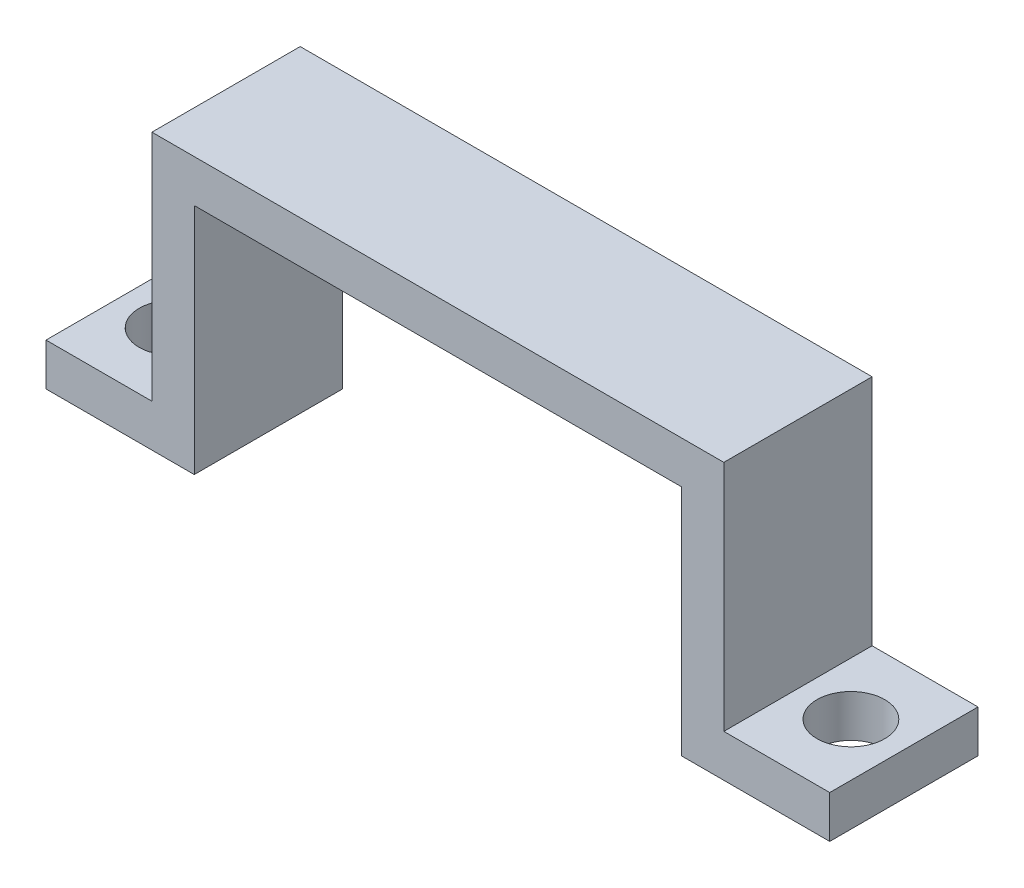
ISO-10303-21;
HEADER;
FILE_DESCRIPTION(('STEP AP214'),'2;1');
FILE_NAME('part.step','',(''),(''),'','','');
FILE_SCHEMA(('AUTOMOTIVE_DESIGN { 1 0 10303 214 1 1 1 1 }'));
ENDSEC;
DATA;
#1=APPLICATION_CONTEXT('core data for automotive mechanical design processes');
#2=APPLICATION_PROTOCOL_DEFINITION('international standard','automotive_design',2000,#1);
#3=PRODUCT_CONTEXT('',#1,'mechanical');
#4=PRODUCT('Part','Part','',(#3));
#5=PRODUCT_RELATED_PRODUCT_CATEGORY('part','',(#4));
#6=PRODUCT_DEFINITION_FORMATION('','',#4);
#7=PRODUCT_DEFINITION_CONTEXT('part definition',#1,'design');
#8=PRODUCT_DEFINITION('design','',#6,#7);
#9=PRODUCT_DEFINITION_SHAPE('','',#8);
#10=(LENGTH_UNIT() NAMED_UNIT(*) SI_UNIT(.MILLI.,.METRE.));
#11=(NAMED_UNIT(*) PLANE_ANGLE_UNIT() SI_UNIT($,.RADIAN.));
#12=(NAMED_UNIT(*) SI_UNIT($,.STERADIAN.) SOLID_ANGLE_UNIT());
#13=UNCERTAINTY_MEASURE_WITH_UNIT(LENGTH_MEASURE(1.E-05),#10,'distance_accuracy_value','');
#14=(GEOMETRIC_REPRESENTATION_CONTEXT(3) GLOBAL_UNCERTAINTY_ASSIGNED_CONTEXT((#13)) GLOBAL_UNIT_ASSIGNED_CONTEXT((#10,
#11,#12)) REPRESENTATION_CONTEXT('',''));
#15=CARTESIAN_POINT('',(0.,0.,0.));
#16=DIRECTION('',(0.,0.,1.));
#17=DIRECTION('',(1.,0.,0.));
#18=AXIS2_PLACEMENT_3D('',#15,#16,#17);
#19=CARTESIAN_POINT('',(13.5,-11.,7.));
#20=DIRECTION('',(0.,-1.,0.));
#21=DIRECTION('',(0.,0.,-1.));
#22=AXIS2_PLACEMENT_3D('',#19,#20,#21);
#23=PLANE('',#22);
#24=CARTESIAN_POINT('',(16.,-11.,3.5));
#25=DIRECTION('',(0.,1.,0.));
#26=DIRECTION('',(0.,0.,1.));
#27=AXIS2_PLACEMENT_3D('',#24,#25,#26);
#28=CIRCLE('',#27,1.6);
#29=CARTESIAN_POINT('',(16.,-11.,5.1));
#30=VERTEX_POINT('',#29);
#31=EDGE_CURVE('E262',#30,#30,#28,.T.);
#32=ORIENTED_EDGE('',*,*,#31,.F.);
#33=EDGE_LOOP('',(#32));
#34=FACE_BOUND('',#33,.T.);
#35=DIRECTION('',(-1.,0.,0.));
#36=VECTOR('',#35,1.);
#37=CARTESIAN_POINT('',(13.5,-11.,0.));
#38=LINE('',#37,#36);
#39=CARTESIAN_POINT('',(18.5,-11.,0.));
#40=VERTEX_POINT('',#39);
#41=CARTESIAN_POINT('',(13.5,-11.,0.));
#42=VERTEX_POINT('',#41);
#43=EDGE_CURVE('E153',#40,#42,#38,.T.);
#44=ORIENTED_EDGE('',*,*,#43,.T.);
#45=DIRECTION('',(0.,0.,-1.));
#46=VECTOR('',#45,1.);
#47=CARTESIAN_POINT('',(13.5,-11.,7.));
#48=LINE('',#47,#46);
#49=CARTESIAN_POINT('',(13.5,-11.,7.));
#50=VERTEX_POINT('',#49);
#51=EDGE_CURVE('E11',#50,#42,#48,.T.);
#52=ORIENTED_EDGE('',*,*,#51,.F.);
#53=DIRECTION('',(-1.,0.,0.));
#54=VECTOR('',#53,1.);
#55=CARTESIAN_POINT('',(13.5,-11.,7.));
#56=LINE('',#55,#54);
#57=CARTESIAN_POINT('',(18.5,-11.,7.));
#58=VERTEX_POINT('',#57);
#59=EDGE_CURVE('E176',#58,#50,#56,.T.);
#60=ORIENTED_EDGE('',*,*,#59,.F.);
#61=DIRECTION('',(0.,0.,-1.));
#62=VECTOR('',#61,1.);
#63=CARTESIAN_POINT('',(18.5,-11.,7.));
#64=LINE('',#63,#62);
#65=EDGE_CURVE('E149',#58,#40,#64,.T.);
#66=ORIENTED_EDGE('',*,*,#65,.T.);
#67=EDGE_LOOP('',(#44,#52,#60,#66));
#68=FACE_BOUND('',#67,.T.);
#69=ADVANCED_FACE('F33',(#34,#68),#23,.F.);
#70=CARTESIAN_POINT('',(13.5,0.,7.));
#71=DIRECTION('',(-1.,0.,0.));
#72=DIRECTION('',(0.,-1.,0.));
#73=AXIS2_PLACEMENT_3D('',#70,#71,#72);
#74=PLANE('',#73);
#75=DIRECTION('',(0.,1.,0.));
#76=VECTOR('',#75,1.);
#77=CARTESIAN_POINT('',(13.5,0.,0.));
#78=LINE('',#77,#76);
#79=CARTESIAN_POINT('',(13.5,0.,0.));
#80=VERTEX_POINT('',#79);
#81=EDGE_CURVE('E156',#42,#80,#78,.T.);
#82=ORIENTED_EDGE('',*,*,#81,.T.);
#83=DIRECTION('',(0.,0.,-1.));
#84=VECTOR('',#83,1.);
#85=CARTESIAN_POINT('',(13.5,0.,7.));
#86=LINE('',#85,#84);
#87=CARTESIAN_POINT('',(13.5,0.,7.));
#88=VERTEX_POINT('',#87);
#89=EDGE_CURVE('E41',#88,#80,#86,.T.);
#90=ORIENTED_EDGE('',*,*,#89,.F.);
#91=DIRECTION('',(0.,1.,0.));
#92=VECTOR('',#91,1.);
#93=CARTESIAN_POINT('',(13.5,0.,7.));
#94=LINE('',#93,#92);
#95=EDGE_CURVE('E104',#50,#88,#94,.T.);
#96=ORIENTED_EDGE('',*,*,#95,.F.);
#97=ORIENTED_EDGE('',*,*,#51,.T.);
#98=EDGE_LOOP('',(#82,#90,#96,#97));
#99=FACE_BOUND('',#98,.T.);
#100=ADVANCED_FACE('F255',(#99),#74,.F.);
#101=CARTESIAN_POINT('',(-13.5,0.,7.));
#102=DIRECTION('',(0.,-1.,0.));
#103=DIRECTION('',(1.,0.,0.));
#104=AXIS2_PLACEMENT_3D('',#101,#102,#103);
#105=PLANE('',#104);
#106=DIRECTION('',(-1.,0.,0.));
#107=VECTOR('',#106,1.);
#108=CARTESIAN_POINT('',(-13.5,0.,0.));
#109=LINE('',#108,#107);
#110=CARTESIAN_POINT('',(-13.5,0.,0.));
#111=VERTEX_POINT('',#110);
#112=EDGE_CURVE('E159',#80,#111,#109,.T.);
#113=ORIENTED_EDGE('',*,*,#112,.T.);
#114=DIRECTION('',(0.,0.,-1.));
#115=VECTOR('',#114,1.);
#116=CARTESIAN_POINT('',(-13.5,0.,7.));
#117=LINE('',#116,#115);
#118=CARTESIAN_POINT('',(-13.5,0.,7.));
#119=VERTEX_POINT('',#118);
#120=EDGE_CURVE('E195',#119,#111,#117,.T.);
#121=ORIENTED_EDGE('',*,*,#120,.F.);
#122=DIRECTION('',(-1.,0.,0.));
#123=VECTOR('',#122,1.);
#124=CARTESIAN_POINT('',(-13.5,0.,7.));
#125=LINE('',#124,#123);
#126=EDGE_CURVE('E203',#88,#119,#125,.T.);
#127=ORIENTED_EDGE('',*,*,#126,.F.);
#128=ORIENTED_EDGE('',*,*,#89,.T.);
#129=EDGE_LOOP('',(#113,#121,#127,#128));
#130=FACE_BOUND('',#129,.T.);
#131=ADVANCED_FACE('F201',(#130),#105,.F.);
#132=CARTESIAN_POINT('',(-13.5,0.,7.));
#133=DIRECTION('',(1.,0.,0.));
#134=DIRECTION('',(0.,0.,-1.));
#135=AXIS2_PLACEMENT_3D('',#132,#133,#134);
#136=PLANE('',#135);
#137=DIRECTION('',(0.,-1.,0.));
#138=VECTOR('',#137,1.);
#139=CARTESIAN_POINT('',(-13.5,0.,0.));
#140=LINE('',#139,#138);
#141=CARTESIAN_POINT('',(-13.5,-11.,0.));
#142=VERTEX_POINT('',#141);
#143=EDGE_CURVE('E161',#111,#142,#140,.T.);
#144=ORIENTED_EDGE('',*,*,#143,.T.);
#145=DIRECTION('',(0.,0.,-1.));
#146=VECTOR('',#145,1.);
#147=CARTESIAN_POINT('',(-13.5,-11.,7.));
#148=LINE('',#147,#146);
#149=CARTESIAN_POINT('',(-13.5,-11.,7.));
#150=VERTEX_POINT('',#149);
#151=EDGE_CURVE('E192',#150,#142,#148,.T.);
#152=ORIENTED_EDGE('',*,*,#151,.F.);
#153=DIRECTION('',(0.,-1.,0.));
#154=VECTOR('',#153,1.);
#155=CARTESIAN_POINT('',(-13.5,0.,7.));
#156=LINE('',#155,#154);
#157=EDGE_CURVE('E221',#119,#150,#156,.T.);
#158=ORIENTED_EDGE('',*,*,#157,.F.);
#159=ORIENTED_EDGE('',*,*,#120,.T.);
#160=EDGE_LOOP('',(#144,#152,#158,#159));
#161=FACE_BOUND('',#160,.T.);
#162=ADVANCED_FACE('F212',(#161),#136,.F.);
#163=CARTESIAN_POINT('',(-13.5,-11.,7.));
#164=DIRECTION('',(0.,-1.,0.));
#165=DIRECTION('',(0.,0.,-1.));
#166=AXIS2_PLACEMENT_3D('',#163,#164,#165);
#167=PLANE('',#166);
#168=CARTESIAN_POINT('',(-16.,-11.,3.5));
#169=DIRECTION('',(0.,1.,0.));
#170=DIRECTION('',(0.,0.,1.));
#171=AXIS2_PLACEMENT_3D('',#168,#169,#170);
#172=CIRCLE('',#171,1.6);
#173=CARTESIAN_POINT('',(-16.,-11.,5.10000000000001));
#174=VERTEX_POINT('',#173);
#175=EDGE_CURVE('E269',#174,#174,#172,.T.);
#176=ORIENTED_EDGE('',*,*,#175,.F.);
#177=EDGE_LOOP('',(#176));
#178=FACE_BOUND('',#177,.T.);
#179=DIRECTION('',(-1.,0.,0.));
#180=VECTOR('',#179,1.);
#181=CARTESIAN_POINT('',(-13.5,-11.,0.));
#182=LINE('',#181,#180);
#183=CARTESIAN_POINT('',(-18.5,-11.,0.));
#184=VERTEX_POINT('',#183);
#185=EDGE_CURVE('E163',#142,#184,#182,.T.);
#186=ORIENTED_EDGE('',*,*,#185,.T.);
#187=DIRECTION('',(0.,0.,-1.));
#188=VECTOR('',#187,1.);
#189=CARTESIAN_POINT('',(-18.5,-11.,7.));
#190=LINE('',#189,#188);
#191=CARTESIAN_POINT('',(-18.5,-11.,7.));
#192=VERTEX_POINT('',#191);
#193=EDGE_CURVE('E189',#192,#184,#190,.T.);
#194=ORIENTED_EDGE('',*,*,#193,.F.);
#195=DIRECTION('',(-1.,0.,0.));
#196=VECTOR('',#195,1.);
#197=CARTESIAN_POINT('',(-13.5,-11.,7.));
#198=LINE('',#197,#196);
#199=EDGE_CURVE('E218',#150,#192,#198,.T.);
#200=ORIENTED_EDGE('',*,*,#199,.F.);
#201=ORIENTED_EDGE('',*,*,#151,.T.);
#202=EDGE_LOOP('',(#186,#194,#200,#201));
#203=FACE_BOUND('',#202,.T.);
#204=ADVANCED_FACE('F216',(#178,#203),#167,.F.);
#205=CARTESIAN_POINT('',(-18.5,-11.,7.));
#206=DIRECTION('',(1.,0.,0.));
#207=DIRECTION('',(0.,0.,-1.));
#208=AXIS2_PLACEMENT_3D('',#205,#206,#207);
#209=PLANE('',#208);
#210=DIRECTION('',(0.,-1.,0.));
#211=VECTOR('',#210,1.);
#212=CARTESIAN_POINT('',(-18.5,-11.,0.));
#213=LINE('',#212,#211);
#214=CARTESIAN_POINT('',(-18.5,-13.,0.));
#215=VERTEX_POINT('',#214);
#216=EDGE_CURVE('E165',#184,#215,#213,.T.);
#217=ORIENTED_EDGE('',*,*,#216,.T.);
#218=DIRECTION('',(0.,0.,-1.));
#219=VECTOR('',#218,1.);
#220=CARTESIAN_POINT('',(-18.5,-13.,7.));
#221=LINE('',#220,#219);
#222=CARTESIAN_POINT('',(-18.5,-13.,7.));
#223=VERTEX_POINT('',#222);
#224=EDGE_CURVE('E186',#223,#215,#221,.T.);
#225=ORIENTED_EDGE('',*,*,#224,.F.);
#226=DIRECTION('',(0.,-1.,0.));
#227=VECTOR('',#226,1.);
#228=CARTESIAN_POINT('',(-18.5,-11.,7.));
#229=LINE('',#228,#227);
#230=EDGE_CURVE('E220',#192,#223,#229,.T.);
#231=ORIENTED_EDGE('',*,*,#230,.F.);
#232=ORIENTED_EDGE('',*,*,#193,.T.);
#233=EDGE_LOOP('',(#217,#225,#231,#232));
#234=FACE_BOUND('',#233,.T.);
#235=ADVANCED_FACE('F280',(#234),#209,.F.);
#236=CARTESIAN_POINT('',(-18.5,-13.,7.));
#237=DIRECTION('',(0.,1.,0.));
#238=DIRECTION('',(0.,0.,1.));
#239=AXIS2_PLACEMENT_3D('',#236,#237,#238);
#240=PLANE('',#239);
#241=CARTESIAN_POINT('',(-16.,-13.,3.5));
#242=DIRECTION('',(0.,1.,0.));
#243=DIRECTION('',(0.,0.,1.));
#244=AXIS2_PLACEMENT_3D('',#241,#242,#243);
#245=CIRCLE('',#244,1.6);
#246=CARTESIAN_POINT('',(-16.,-13.,5.10000000000001));
#247=VERTEX_POINT('',#246);
#248=EDGE_CURVE('E264',#247,#247,#245,.T.);
#249=ORIENTED_EDGE('',*,*,#248,.T.);
#250=EDGE_LOOP('',(#249));
#251=FACE_BOUND('',#250,.T.);
#252=DIRECTION('',(1.,0.,0.));
#253=VECTOR('',#252,1.);
#254=CARTESIAN_POINT('',(-18.5,-13.,0.));
#255=LINE('',#254,#253);
#256=CARTESIAN_POINT('',(-11.5,-13.,0.));
#257=VERTEX_POINT('',#256);
#258=EDGE_CURVE('E167',#215,#257,#255,.T.);
#259=ORIENTED_EDGE('',*,*,#258,.T.);
#260=DIRECTION('',(0.,0.,-1.));
#261=VECTOR('',#260,1.);
#262=CARTESIAN_POINT('',(-11.5,-13.,7.));
#263=LINE('',#262,#261);
#264=CARTESIAN_POINT('',(-11.5,-13.,7.));
#265=VERTEX_POINT('',#264);
#266=EDGE_CURVE('E183',#265,#257,#263,.T.);
#267=ORIENTED_EDGE('',*,*,#266,.F.);
#268=DIRECTION('',(1.,0.,0.));
#269=VECTOR('',#268,1.);
#270=CARTESIAN_POINT('',(-18.5,-13.,7.));
#271=LINE('',#270,#269);
#272=EDGE_CURVE('E223',#223,#265,#271,.T.);
#273=ORIENTED_EDGE('',*,*,#272,.F.);
#274=ORIENTED_EDGE('',*,*,#224,.T.);
#275=EDGE_LOOP('',(#259,#267,#273,#274));
#276=FACE_BOUND('',#275,.T.);
#277=ADVANCED_FACE('F286',(#251,#276),#240,.F.);
#278=CARTESIAN_POINT('',(-11.5,-13.,7.));
#279=DIRECTION('',(-1.,0.,0.));
#280=DIRECTION('',(0.,0.,1.));
#281=AXIS2_PLACEMENT_3D('',#278,#279,#280);
#282=PLANE('',#281);
#283=DIRECTION('',(0.,1.,0.));
#284=VECTOR('',#283,1.);
#285=CARTESIAN_POINT('',(-11.5,-13.,0.));
#286=LINE('',#285,#284);
#287=CARTESIAN_POINT('',(-11.5,-2.,0.));
#288=VERTEX_POINT('',#287);
#289=EDGE_CURVE('E169',#257,#288,#286,.T.);
#290=ORIENTED_EDGE('',*,*,#289,.T.);
#291=DIRECTION('',(0.,0.,-1.));
#292=VECTOR('',#291,1.);
#293=CARTESIAN_POINT('',(-11.5,-2.,7.));
#294=LINE('',#293,#292);
#295=CARTESIAN_POINT('',(-11.5,-2.,7.));
#296=VERTEX_POINT('',#295);
#297=EDGE_CURVE('E180',#296,#288,#294,.T.);
#298=ORIENTED_EDGE('',*,*,#297,.F.);
#299=DIRECTION('',(0.,1.,0.));
#300=VECTOR('',#299,1.);
#301=CARTESIAN_POINT('',(-11.5,-13.,7.));
#302=LINE('',#301,#300);
#303=EDGE_CURVE('E229',#265,#296,#302,.T.);
#304=ORIENTED_EDGE('',*,*,#303,.F.);
#305=ORIENTED_EDGE('',*,*,#266,.T.);
#306=EDGE_LOOP('',(#290,#298,#304,#305));
#307=FACE_BOUND('',#306,.T.);
#308=ADVANCED_FACE('F235',(#307),#282,.F.);
#309=CARTESIAN_POINT('',(-11.5,-2.,7.));
#310=DIRECTION('',(0.,1.,0.));
#311=DIRECTION('',(0.,0.,1.));
#312=AXIS2_PLACEMENT_3D('',#309,#310,#311);
#313=PLANE('',#312);
#314=DIRECTION('',(1.,0.,0.));
#315=VECTOR('',#314,1.);
#316=CARTESIAN_POINT('',(-11.5,-2.,0.));
#317=LINE('',#316,#315);
#318=CARTESIAN_POINT('',(11.5,-2.,0.));
#319=VERTEX_POINT('',#318);
#320=EDGE_CURVE('E171',#288,#319,#317,.T.);
#321=ORIENTED_EDGE('',*,*,#320,.T.);
#322=DIRECTION('',(0.,0.,-1.));
#323=VECTOR('',#322,1.);
#324=CARTESIAN_POINT('',(11.5,-2.,7.));
#325=LINE('',#324,#323);
#326=CARTESIAN_POINT('',(11.5,-2.,7.));
#327=VERTEX_POINT('',#326);
#328=EDGE_CURVE('E144',#327,#319,#325,.T.);
#329=ORIENTED_EDGE('',*,*,#328,.F.);
#330=DIRECTION('',(1.,0.,0.));
#331=VECTOR('',#330,1.);
#332=CARTESIAN_POINT('',(-11.5,-2.,7.));
#333=LINE('',#332,#331);
#334=EDGE_CURVE('E135',#296,#327,#333,.T.);
#335=ORIENTED_EDGE('',*,*,#334,.F.);
#336=ORIENTED_EDGE('',*,*,#297,.T.);
#337=EDGE_LOOP('',(#321,#329,#335,#336));
#338=FACE_BOUND('',#337,.T.);
#339=ADVANCED_FACE('F239',(#338),#313,.F.);
#340=CARTESIAN_POINT('',(11.5,-2.,7.));
#341=DIRECTION('',(1.,0.,0.));
#342=DIRECTION('',(0.,0.,-1.));
#343=AXIS2_PLACEMENT_3D('',#340,#341,#342);
#344=PLANE('',#343);
#345=DIRECTION('',(0.,-1.,0.));
#346=VECTOR('',#345,1.);
#347=CARTESIAN_POINT('',(11.5,-2.,0.));
#348=LINE('',#347,#346);
#349=CARTESIAN_POINT('',(11.5,-13.,0.));
#350=VERTEX_POINT('',#349);
#351=EDGE_CURVE('E143',#319,#350,#348,.T.);
#352=ORIENTED_EDGE('',*,*,#351,.T.);
#353=DIRECTION('',(0.,0.,-1.));
#354=VECTOR('',#353,1.);
#355=CARTESIAN_POINT('',(11.5,-13.,7.));
#356=LINE('',#355,#354);
#357=CARTESIAN_POINT('',(11.5,-13.,7.));
#358=VERTEX_POINT('',#357);
#359=EDGE_CURVE('E140',#358,#350,#356,.T.);
#360=ORIENTED_EDGE('',*,*,#359,.F.);
#361=DIRECTION('',(0.,-1.,0.));
#362=VECTOR('',#361,1.);
#363=CARTESIAN_POINT('',(11.5,-2.,7.));
#364=LINE('',#363,#362);
#365=EDGE_CURVE('E129',#327,#358,#364,.T.);
#366=ORIENTED_EDGE('',*,*,#365,.F.);
#367=ORIENTED_EDGE('',*,*,#328,.T.);
#368=EDGE_LOOP('',(#352,#360,#366,#367));
#369=FACE_BOUND('',#368,.T.);
#370=ADVANCED_FACE('F141',(#369),#344,.F.);
#371=CARTESIAN_POINT('',(11.5,-13.,7.));
#372=DIRECTION('',(0.,1.,0.));
#373=DIRECTION('',(0.,0.,1.));
#374=AXIS2_PLACEMENT_3D('',#371,#372,#373);
#375=PLANE('',#374);
#376=CARTESIAN_POINT('',(16.,-13.,3.5));
#377=DIRECTION('',(0.,1.,0.));
#378=DIRECTION('',(0.,0.,1.));
#379=AXIS2_PLACEMENT_3D('',#376,#377,#378);
#380=CIRCLE('',#379,1.6);
#381=CARTESIAN_POINT('',(16.,-13.,5.1));
#382=VERTEX_POINT('',#381);
#383=EDGE_CURVE('E157',#382,#382,#380,.T.);
#384=ORIENTED_EDGE('',*,*,#383,.T.);
#385=EDGE_LOOP('',(#384));
#386=FACE_BOUND('',#385,.T.);
#387=DIRECTION('',(1.,0.,0.));
#388=VECTOR('',#387,1.);
#389=CARTESIAN_POINT('',(11.5,-13.,0.));
#390=LINE('',#389,#388);
#391=CARTESIAN_POINT('',(18.5,-13.,0.));
#392=VERTEX_POINT('',#391);
#393=EDGE_CURVE('E90',#350,#392,#390,.T.);
#394=ORIENTED_EDGE('',*,*,#393,.T.);
#395=DIRECTION('',(0.,0.,-1.));
#396=VECTOR('',#395,1.);
#397=CARTESIAN_POINT('',(18.5,-13.,7.));
#398=LINE('',#397,#396);
#399=CARTESIAN_POINT('',(18.5,-13.,7.));
#400=VERTEX_POINT('',#399);
#401=EDGE_CURVE('E145',#400,#392,#398,.T.);
#402=ORIENTED_EDGE('',*,*,#401,.F.);
#403=DIRECTION('',(1.,0.,0.));
#404=VECTOR('',#403,1.);
#405=CARTESIAN_POINT('',(11.5,-13.,7.));
#406=LINE('',#405,#404);
#407=EDGE_CURVE('E133',#358,#400,#406,.T.);
#408=ORIENTED_EDGE('',*,*,#407,.F.);
#409=ORIENTED_EDGE('',*,*,#359,.T.);
#410=EDGE_LOOP('',(#394,#402,#408,#409));
#411=FACE_BOUND('',#410,.T.);
#412=ADVANCED_FACE('F147',(#386,#411),#375,.F.);
#413=CARTESIAN_POINT('',(18.5,-13.,7.));
#414=DIRECTION('',(-1.,0.,0.));
#415=DIRECTION('',(0.,0.,1.));
#416=AXIS2_PLACEMENT_3D('',#413,#414,#415);
#417=PLANE('',#416);
#418=DIRECTION('',(0.,1.,0.));
#419=VECTOR('',#418,1.);
#420=CARTESIAN_POINT('',(18.5,-13.,0.));
#421=LINE('',#420,#419);
#422=EDGE_CURVE('E96',#392,#40,#421,.T.);
#423=ORIENTED_EDGE('',*,*,#422,.T.);
#424=ORIENTED_EDGE('',*,*,#65,.F.);
#425=DIRECTION('',(0.,1.,0.));
#426=VECTOR('',#425,1.);
#427=CARTESIAN_POINT('',(18.5,-13.,7.));
#428=LINE('',#427,#426);
#429=EDGE_CURVE('E49',#400,#58,#428,.T.);
#430=ORIENTED_EDGE('',*,*,#429,.F.);
#431=ORIENTED_EDGE('',*,*,#401,.T.);
#432=EDGE_LOOP('',(#423,#424,#430,#431));
#433=FACE_BOUND('',#432,.T.);
#434=ADVANCED_FACE('F243',(#433),#417,.F.);
#435=CARTESIAN_POINT('',(0.,0.,7.));
#436=DIRECTION('',(0.,0.,1.));
#437=DIRECTION('',(1.,0.,0.));
#438=AXIS2_PLACEMENT_3D('',#435,#436,#437);
#439=PLANE('',#438);
#440=ORIENTED_EDGE('',*,*,#59,.T.);
#441=ORIENTED_EDGE('',*,*,#95,.T.);
#442=ORIENTED_EDGE('',*,*,#126,.T.);
#443=ORIENTED_EDGE('',*,*,#157,.T.);
#444=ORIENTED_EDGE('',*,*,#199,.T.);
#445=ORIENTED_EDGE('',*,*,#230,.T.);
#446=ORIENTED_EDGE('',*,*,#272,.T.);
#447=ORIENTED_EDGE('',*,*,#303,.T.);
#448=ORIENTED_EDGE('',*,*,#334,.T.);
#449=ORIENTED_EDGE('',*,*,#365,.T.);
#450=ORIENTED_EDGE('',*,*,#407,.T.);
#451=ORIENTED_EDGE('',*,*,#429,.T.);
#452=EDGE_LOOP('',(#440,#441,#442,#443,#444,#445,#446,#447,#448,#449,#450,#451));
#453=FACE_BOUND('',#452,.T.);
#454=ADVANCED_FACE('F131',(#453),#439,.T.);
#455=CARTESIAN_POINT('',(0.,0.,0.));
#456=DIRECTION('',(0.,0.,1.));
#457=DIRECTION('',(1.,0.,0.));
#458=AXIS2_PLACEMENT_3D('',#455,#456,#457);
#459=PLANE('',#458);
#460=ORIENTED_EDGE('',*,*,#43,.F.);
#461=ORIENTED_EDGE('',*,*,#422,.F.);
#462=ORIENTED_EDGE('',*,*,#393,.F.);
#463=ORIENTED_EDGE('',*,*,#351,.F.);
#464=ORIENTED_EDGE('',*,*,#320,.F.);
#465=ORIENTED_EDGE('',*,*,#289,.F.);
#466=ORIENTED_EDGE('',*,*,#258,.F.);
#467=ORIENTED_EDGE('',*,*,#216,.F.);
#468=ORIENTED_EDGE('',*,*,#185,.F.);
#469=ORIENTED_EDGE('',*,*,#143,.F.);
#470=ORIENTED_EDGE('',*,*,#112,.F.);
#471=ORIENTED_EDGE('',*,*,#81,.F.);
#472=EDGE_LOOP('',(#460,#461,#462,#463,#464,#465,#466,#467,#468,#469,#470,#471));
#473=FACE_BOUND('',#472,.T.);
#474=ADVANCED_FACE('F207',(#473),#459,.F.);
#475=CARTESIAN_POINT('',(16.,-13.,3.5));
#476=DIRECTION('',(0.,1.,0.));
#477=DIRECTION('',(0.,0.,1.));
#478=AXIS2_PLACEMENT_3D('',#475,#476,#477);
#479=CYLINDRICAL_SURFACE('',#478,1.6);
#480=ORIENTED_EDGE('',*,*,#383,.F.);
#481=EDGE_LOOP('',(#480));
#482=FACE_BOUND('',#481,.T.);
#483=ORIENTED_EDGE('',*,*,#31,.T.);
#484=EDGE_LOOP('',(#483));
#485=FACE_BOUND('',#484,.T.);
#486=ADVANCED_FACE('F353',(#482,#485),#479,.F.);
#487=CARTESIAN_POINT('',(-16.,-13.,3.5));
#488=DIRECTION('',(0.,1.,0.));
#489=DIRECTION('',(0.,0.,1.));
#490=AXIS2_PLACEMENT_3D('',#487,#488,#489);
#491=CYLINDRICAL_SURFACE('',#490,1.6);
#492=ORIENTED_EDGE('',*,*,#248,.F.);
#493=EDGE_LOOP('',(#492));
#494=FACE_BOUND('',#493,.T.);
#495=ORIENTED_EDGE('',*,*,#175,.T.);
#496=EDGE_LOOP('',(#495));
#497=FACE_BOUND('',#496,.T.);
#498=ADVANCED_FACE('F277',(#494,#497),#491,.F.);
#499=CLOSED_SHELL('',(#69,#100,#131,#162,#204,#235,#277,#308,#339,#370,#412,#434,#454,#474,#486,#498));
#500=MANIFOLD_SOLID_BREP('B2',#499);
#501=ADVANCED_BREP_SHAPE_REPRESENTATION('',(#18,#500),#14);
#502=SHAPE_DEFINITION_REPRESENTATION(#9,#501);
ENDSEC;
END-ISO-10303-21;
